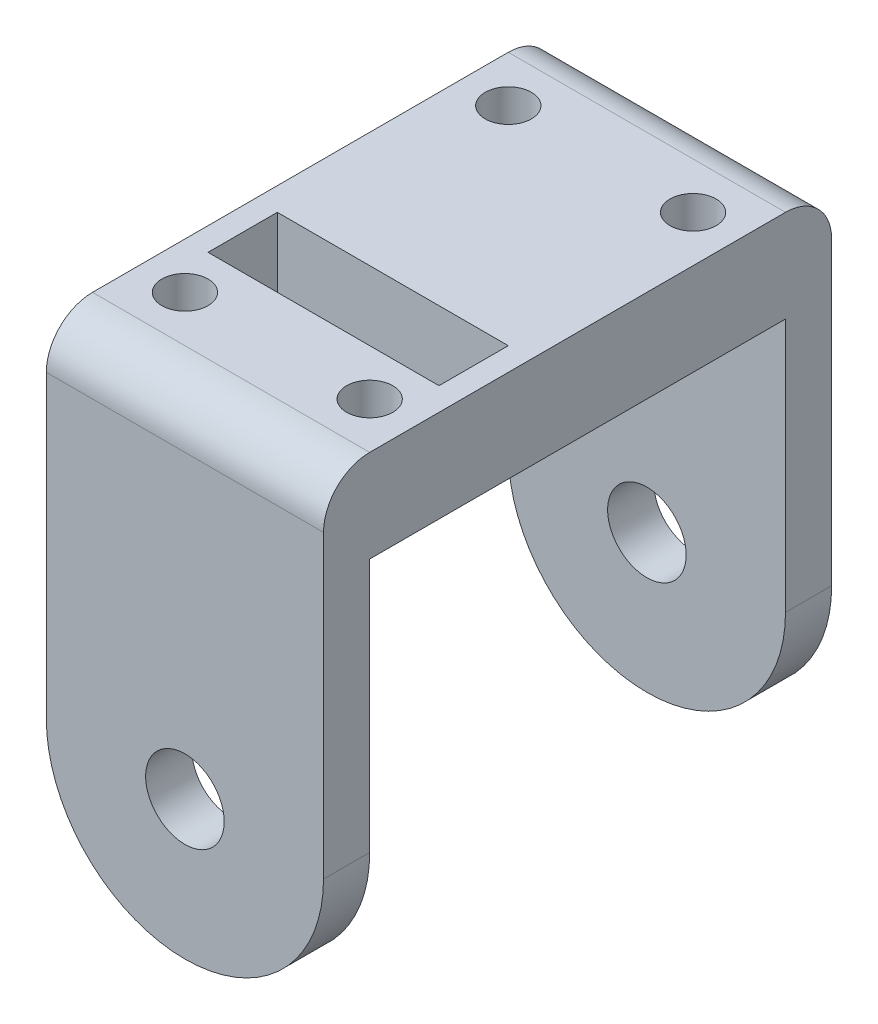
ISO-10303-21;
HEADER;
FILE_DESCRIPTION(('STEP AP214'),'2;1');
FILE_NAME('part.step','',(''),(''),'','','');
FILE_SCHEMA(('AUTOMOTIVE_DESIGN { 1 0 10303 214 1 1 1 1 }'));
ENDSEC;
DATA;
#1=APPLICATION_CONTEXT('core data for automotive mechanical design processes');
#2=APPLICATION_PROTOCOL_DEFINITION('international standard','automotive_design',2000,#1);
#3=PRODUCT_CONTEXT('',#1,'mechanical');
#4=PRODUCT('Part','Part','',(#3));
#5=PRODUCT_RELATED_PRODUCT_CATEGORY('part','',(#4));
#6=PRODUCT_DEFINITION_FORMATION('','',#4);
#7=PRODUCT_DEFINITION_CONTEXT('part definition',#1,'design');
#8=PRODUCT_DEFINITION('design','',#6,#7);
#9=PRODUCT_DEFINITION_SHAPE('','',#8);
#10=(LENGTH_UNIT() NAMED_UNIT(*) SI_UNIT(.MILLI.,.METRE.));
#11=(NAMED_UNIT(*) PLANE_ANGLE_UNIT() SI_UNIT($,.RADIAN.));
#12=(NAMED_UNIT(*) SI_UNIT($,.STERADIAN.) SOLID_ANGLE_UNIT());
#13=UNCERTAINTY_MEASURE_WITH_UNIT(LENGTH_MEASURE(1.E-05),#10,'distance_accuracy_value','');
#14=(GEOMETRIC_REPRESENTATION_CONTEXT(3) GLOBAL_UNCERTAINTY_ASSIGNED_CONTEXT((#13)) GLOBAL_UNIT_ASSIGNED_CONTEXT((#10,
#11,#12)) REPRESENTATION_CONTEXT('',''));
#15=CARTESIAN_POINT('',(0.,0.,0.));
#16=DIRECTION('',(0.,0.,1.));
#17=DIRECTION('',(1.,0.,0.));
#18=AXIS2_PLACEMENT_3D('',#15,#16,#17);
#19=CARTESIAN_POINT('',(0.,0.,0.));
#20=DIRECTION('',(0.,1.,0.));
#21=DIRECTION('',(0.,0.,1.));
#22=AXIS2_PLACEMENT_3D('',#19,#20,#21);
#23=PLANE('',#22);
#24=DIRECTION('',(0.,0.,1.));
#25=VECTOR('',#24,1.);
#26=CARTESIAN_POINT('',(-30.,0.,-45.));
#27=LINE('',#26,#25);
#28=CARTESIAN_POINT('',(-30.,0.,25.));
#29=VERTEX_POINT('',#28);
#30=CARTESIAN_POINT('',(-30.,0.,45.));
#31=VERTEX_POINT('',#30);
#32=EDGE_CURVE('E321',#29,#31,#27,.T.);
#33=ORIENTED_EDGE('',*,*,#32,.F.);
#34=DIRECTION('',(1.,0.,0.));
#35=VECTOR('',#34,1.);
#36=CARTESIAN_POINT('',(0.,0.,25.));
#37=LINE('',#36,#35);
#38=CARTESIAN_POINT('',(30.,0.,25.));
#39=VERTEX_POINT('',#38);
#40=EDGE_CURVE('E361',#29,#39,#37,.T.);
#41=ORIENTED_EDGE('',*,*,#40,.T.);
#42=DIRECTION('',(0.,0.,-1.));
#43=VECTOR('',#42,1.);
#44=CARTESIAN_POINT('',(30.,0.,-45.));
#45=LINE('',#44,#43);
#46=CARTESIAN_POINT('',(30.,0.,45.));
#47=VERTEX_POINT('',#46);
#48=EDGE_CURVE('E312',#47,#39,#45,.T.);
#49=ORIENTED_EDGE('',*,*,#48,.F.);
#50=DIRECTION('',(1.,0.,0.));
#51=VECTOR('',#50,1.);
#52=CARTESIAN_POINT('',(-30.,0.,45.));
#53=LINE('',#52,#51);
#54=EDGE_CURVE('E307',#31,#47,#53,.T.);
#55=ORIENTED_EDGE('',*,*,#54,.F.);
#56=EDGE_LOOP('',(#33,#41,#49,#55));
#57=FACE_BOUND('',#56,.T.);
#58=ADVANCED_FACE('F45',(#57),#23,.F.);
#59=CARTESIAN_POINT('',(0.,20.,0.));
#60=DIRECTION('',(0.,1.,0.));
#61=DIRECTION('',(0.,0.,1.));
#62=AXIS2_PLACEMENT_3D('',#59,#60,#61);
#63=PLANE('',#62);
#64=CARTESIAN_POINT('',(20.,20.,-35.));
#65=DIRECTION('',(0.,1.,0.));
#66=DIRECTION('',(0.,0.,1.));
#67=AXIS2_PLACEMENT_3D('',#64,#65,#66);
#68=CIRCLE('',#67,5.);
#69=CARTESIAN_POINT('',(20.,20.,-30.));
#70=VERTEX_POINT('',#69);
#71=EDGE_CURVE('E269',#70,#70,#68,.T.);
#72=ORIENTED_EDGE('',*,*,#71,.F.);
#73=EDGE_LOOP('',(#72));
#74=FACE_BOUND('',#73,.T.);
#75=CARTESIAN_POINT('',(20.,20.,35.));
#76=DIRECTION('',(0.,1.,0.));
#77=DIRECTION('',(0.,0.,1.));
#78=AXIS2_PLACEMENT_3D('',#75,#76,#77);
#79=CIRCLE('',#78,5.);
#80=CARTESIAN_POINT('',(20.,20.,40.));
#81=VERTEX_POINT('',#80);
#82=EDGE_CURVE('E283',#81,#81,#79,.T.);
#83=ORIENTED_EDGE('',*,*,#82,.F.);
#84=EDGE_LOOP('',(#83));
#85=FACE_BOUND('',#84,.T.);
#86=CARTESIAN_POINT('',(-20.,20.,35.));
#87=DIRECTION('',(0.,1.,0.));
#88=DIRECTION('',(0.,0.,1.));
#89=AXIS2_PLACEMENT_3D('',#86,#87,#88);
#90=CIRCLE('',#89,5.);
#91=CARTESIAN_POINT('',(-20.,20.,40.));
#92=VERTEX_POINT('',#91);
#93=EDGE_CURVE('E275',#92,#92,#90,.T.);
#94=ORIENTED_EDGE('',*,*,#93,.F.);
#95=EDGE_LOOP('',(#94));
#96=FACE_BOUND('',#95,.T.);
#97=CARTESIAN_POINT('',(-20.,20.,-35.));
#98=DIRECTION('',(0.,1.,0.));
#99=DIRECTION('',(0.,0.,1.));
#100=AXIS2_PLACEMENT_3D('',#97,#98,#99);
#101=CIRCLE('',#100,5.);
#102=CARTESIAN_POINT('',(-20.,20.,-30.));
#103=VERTEX_POINT('',#102);
#104=EDGE_CURVE('E274',#103,#103,#101,.T.);
#105=ORIENTED_EDGE('',*,*,#104,.F.);
#106=EDGE_LOOP('',(#105));
#107=FACE_BOUND('',#106,.T.);
#108=DIRECTION('',(0.,0.,-1.));
#109=VECTOR('',#108,1.);
#110=CARTESIAN_POINT('',(30.,20.,-45.));
#111=LINE('',#110,#109);
#112=CARTESIAN_POINT('',(30.,20.,45.));
#113=VERTEX_POINT('',#112);
#114=CARTESIAN_POINT('',(30.,20.,-45.));
#115=VERTEX_POINT('',#114);
#116=EDGE_CURVE('E302',#113,#115,#111,.T.);
#117=ORIENTED_EDGE('',*,*,#116,.T.);
#118=DIRECTION('',(-1.,0.,0.));
#119=VECTOR('',#118,1.);
#120=CARTESIAN_POINT('',(-30.,20.,-45.));
#121=LINE('',#120,#119);
#122=CARTESIAN_POINT('',(-30.,20.,-45.));
#123=VERTEX_POINT('',#122);
#124=EDGE_CURVE('E335',#115,#123,#121,.T.);
#125=ORIENTED_EDGE('',*,*,#124,.T.);
#126=DIRECTION('',(0.,0.,1.));
#127=VECTOR('',#126,1.);
#128=CARTESIAN_POINT('',(-30.,20.,-45.));
#129=LINE('',#128,#127);
#130=CARTESIAN_POINT('',(-30.,20.,45.));
#131=VERTEX_POINT('',#130);
#132=EDGE_CURVE('E306',#123,#131,#129,.T.);
#133=ORIENTED_EDGE('',*,*,#132,.T.);
#134=DIRECTION('',(-1.,0.,0.));
#135=VECTOR('',#134,1.);
#136=CARTESIAN_POINT('',(30.,20.,45.));
#137=LINE('',#136,#135);
#138=EDGE_CURVE('E311',#131,#113,#137,.F.);
#139=ORIENTED_EDGE('',*,*,#138,.T.);
#140=EDGE_LOOP('',(#117,#125,#133,#139));
#141=FACE_BOUND('',#140,.T.);
#142=DIRECTION('',(1.,0.,0.));
#143=VECTOR('',#142,1.);
#144=CARTESIAN_POINT('',(0.,20.,9.99999999999999));
#145=LINE('',#144,#143);
#146=CARTESIAN_POINT('',(-25.,20.,9.99999999999999));
#147=VERTEX_POINT('',#146);
#148=CARTESIAN_POINT('',(25.,20.,9.99999999999999));
#149=VERTEX_POINT('',#148);
#150=EDGE_CURVE('E174',#147,#149,#145,.T.);
#151=ORIENTED_EDGE('',*,*,#150,.T.);
#152=DIRECTION('',(0.,0.,1.));
#153=VECTOR('',#152,1.);
#154=CARTESIAN_POINT('',(25.,20.,0.));
#155=LINE('',#154,#153);
#156=CARTESIAN_POINT('',(25.,20.,25.));
#157=VERTEX_POINT('',#156);
#158=EDGE_CURVE('E180',#149,#157,#155,.T.);
#159=ORIENTED_EDGE('',*,*,#158,.T.);
#160=DIRECTION('',(1.,0.,0.));
#161=VECTOR('',#160,1.);
#162=CARTESIAN_POINT('',(0.,20.,25.));
#163=LINE('',#162,#161);
#164=CARTESIAN_POINT('',(-25.,20.,25.));
#165=VERTEX_POINT('',#164);
#166=EDGE_CURVE('E184',#165,#157,#163,.T.);
#167=ORIENTED_EDGE('',*,*,#166,.F.);
#168=DIRECTION('',(0.,0.,1.));
#169=VECTOR('',#168,1.);
#170=CARTESIAN_POINT('',(-25.,20.,0.));
#171=LINE('',#170,#169);
#172=EDGE_CURVE('E163',#147,#165,#171,.T.);
#173=ORIENTED_EDGE('',*,*,#172,.F.);
#174=EDGE_LOOP('',(#151,#159,#167,#173));
#175=FACE_BOUND('',#174,.T.);
#176=ADVANCED_FACE('F182',(#74,#85,#96,#107,#141,#175),#63,.T.);
#177=DIRECTION('',(1.,0.,0.));
#178=VECTOR('',#177,1.);
#179=CARTESIAN_POINT('',(0.,0.,9.99999999999999));
#180=LINE('',#179,#178);
#181=CARTESIAN_POINT('',(-30.,0.,9.99999999999997));
#182=VERTEX_POINT('',#181);
#183=CARTESIAN_POINT('',(30.,0.,9.99999999999997));
#184=VERTEX_POINT('',#183);
#185=EDGE_CURVE('E358',#182,#184,#180,.T.);
#186=ORIENTED_EDGE('',*,*,#185,.F.);
#187=CARTESIAN_POINT('',(-30.,0.,-45.));
#188=VERTEX_POINT('',#187);
#189=EDGE_CURVE('E322',#188,#182,#27,.T.);
#190=ORIENTED_EDGE('',*,*,#189,.F.);
#191=DIRECTION('',(-1.,0.,0.));
#192=VECTOR('',#191,1.);
#193=CARTESIAN_POINT('',(-30.,0.,-45.));
#194=LINE('',#193,#192);
#195=CARTESIAN_POINT('',(30.,0.,-45.));
#196=VERTEX_POINT('',#195);
#197=EDGE_CURVE('E316',#196,#188,#194,.T.);
#198=ORIENTED_EDGE('',*,*,#197,.F.);
#199=EDGE_CURVE('E298',#184,#196,#45,.T.);
#200=ORIENTED_EDGE('',*,*,#199,.F.);
#201=EDGE_LOOP('',(#186,#190,#198,#200));
#202=FACE_BOUND('',#201,.T.);
#203=ADVANCED_FACE('F391',(#202),#23,.F.);
#204=CARTESIAN_POINT('',(30.,20.,-45.));
#205=DIRECTION('',(-1.,0.,0.));
#206=DIRECTION('',(0.,0.,1.));
#207=AXIS2_PLACEMENT_3D('',#204,#205,#206);
#208=PLANE('',#207);
#209=DIRECTION('',(0.,1.,0.));
#210=VECTOR('',#209,1.);
#211=CARTESIAN_POINT('',(30.,0.,-55.));
#212=LINE('',#211,#210);
#213=CARTESIAN_POINT('',(30.,-55.,-55.));
#214=VERTEX_POINT('',#213);
#215=CARTESIAN_POINT('',(30.,10.,-55.));
#216=VERTEX_POINT('',#215);
#217=EDGE_CURVE('E215',#214,#216,#212,.T.);
#218=ORIENTED_EDGE('',*,*,#217,.T.);
#219=CARTESIAN_POINT('',(30.,10.,-45.));
#220=DIRECTION('',(-1.,0.,0.));
#221=DIRECTION('',(0.,0.,1.));
#222=AXIS2_PLACEMENT_3D('',#219,#220,#221);
#223=CIRCLE('',#222,10.);
#224=EDGE_CURVE('E351',#216,#115,#223,.F.);
#225=ORIENTED_EDGE('',*,*,#224,.T.);
#226=ORIENTED_EDGE('',*,*,#116,.F.);
#227=CARTESIAN_POINT('',(30.,9.99999999999999,45.));
#228=DIRECTION('',(-1.,0.,0.));
#229=DIRECTION('',(0.,0.,1.));
#230=AXIS2_PLACEMENT_3D('',#227,#228,#229);
#231=CIRCLE('',#230,10.);
#232=CARTESIAN_POINT('',(30.,9.99999999999999,55.));
#233=VERTEX_POINT('',#232);
#234=EDGE_CURVE('E348',#113,#233,#231,.F.);
#235=ORIENTED_EDGE('',*,*,#234,.T.);
#236=DIRECTION('',(0.,1.,0.));
#237=VECTOR('',#236,1.);
#238=CARTESIAN_POINT('',(30.,-55.,55.));
#239=LINE('',#238,#237);
#240=CARTESIAN_POINT('',(30.,-55.,55.));
#241=VERTEX_POINT('',#240);
#242=EDGE_CURVE('E248',#241,#233,#239,.T.);
#243=ORIENTED_EDGE('',*,*,#242,.F.);
#244=DIRECTION('',(0.,0.,-1.));
#245=VECTOR('',#244,1.);
#246=CARTESIAN_POINT('',(30.,-55.,55.));
#247=LINE('',#246,#245);
#248=CARTESIAN_POINT('',(30.,-55.,45.));
#249=VERTEX_POINT('',#248);
#250=EDGE_CURVE('E252',#241,#249,#247,.T.);
#251=ORIENTED_EDGE('',*,*,#250,.T.);
#252=DIRECTION('',(0.,1.,0.));
#253=VECTOR('',#252,1.);
#254=CARTESIAN_POINT('',(30.,0.,45.));
#255=LINE('',#254,#253);
#256=EDGE_CURVE('E245',#249,#47,#255,.T.);
#257=ORIENTED_EDGE('',*,*,#256,.T.);
#258=ORIENTED_EDGE('',*,*,#48,.T.);
#259=EDGE_CURVE('E317',#39,#184,#45,.T.);
#260=ORIENTED_EDGE('',*,*,#259,.T.);
#261=ORIENTED_EDGE('',*,*,#199,.T.);
#262=DIRECTION('',(0.,1.,0.));
#263=VECTOR('',#262,1.);
#264=CARTESIAN_POINT('',(30.,-55.,-45.));
#265=LINE('',#264,#263);
#266=CARTESIAN_POINT('',(30.,-55.,-45.));
#267=VERTEX_POINT('',#266);
#268=EDGE_CURVE('E211',#267,#196,#265,.T.);
#269=ORIENTED_EDGE('',*,*,#268,.F.);
#270=DIRECTION('',(0.,0.,1.));
#271=VECTOR('',#270,1.);
#272=CARTESIAN_POINT('',(30.,-55.,-55.));
#273=LINE('',#272,#271);
#274=EDGE_CURVE('E237',#214,#267,#273,.T.);
#275=ORIENTED_EDGE('',*,*,#274,.F.);
#276=EDGE_LOOP('',(#218,#225,#226,#235,#243,#251,#257,#258,#260,#261,#269,#275));
#277=FACE_BOUND('',#276,.T.);
#278=ADVANCED_FACE('F381',(#277),#208,.F.);
#279=CARTESIAN_POINT('',(-30.,20.,-45.));
#280=DIRECTION('',(1.,0.,0.));
#281=DIRECTION('',(0.,0.,-1.));
#282=AXIS2_PLACEMENT_3D('',#279,#280,#281);
#283=PLANE('',#282);
#284=ORIENTED_EDGE('',*,*,#132,.F.);
#285=CARTESIAN_POINT('',(-30.,10.,-45.));
#286=DIRECTION('',(1.,0.,0.));
#287=DIRECTION('',(0.,0.,-1.));
#288=AXIS2_PLACEMENT_3D('',#285,#286,#287);
#289=CIRCLE('',#288,10.);
#290=CARTESIAN_POINT('',(-30.,10.,-55.));
#291=VERTEX_POINT('',#290);
#292=EDGE_CURVE('E342',#123,#291,#289,.F.);
#293=ORIENTED_EDGE('',*,*,#292,.T.);
#294=DIRECTION('',(0.,-1.,0.));
#295=VECTOR('',#294,1.);
#296=CARTESIAN_POINT('',(-30.,20.,-55.));
#297=LINE('',#296,#295);
#298=CARTESIAN_POINT('',(-30.,-55.,-55.));
#299=VERTEX_POINT('',#298);
#300=EDGE_CURVE('E212',#291,#299,#297,.T.);
#301=ORIENTED_EDGE('',*,*,#300,.T.);
#302=DIRECTION('',(0.,0.,1.));
#303=VECTOR('',#302,1.);
#304=CARTESIAN_POINT('',(-30.,-55.,-55.));
#305=LINE('',#304,#303);
#306=CARTESIAN_POINT('',(-30.,-55.,-45.));
#307=VERTEX_POINT('',#306);
#308=EDGE_CURVE('E224',#299,#307,#305,.T.);
#309=ORIENTED_EDGE('',*,*,#308,.T.);
#310=DIRECTION('',(0.,-1.,0.));
#311=VECTOR('',#310,1.);
#312=CARTESIAN_POINT('',(-30.,0.,-45.));
#313=LINE('',#312,#311);
#314=EDGE_CURVE('E216',#188,#307,#313,.T.);
#315=ORIENTED_EDGE('',*,*,#314,.F.);
#316=ORIENTED_EDGE('',*,*,#189,.T.);
#317=EDGE_CURVE('E326',#182,#29,#27,.T.);
#318=ORIENTED_EDGE('',*,*,#317,.T.);
#319=ORIENTED_EDGE('',*,*,#32,.T.);
#320=DIRECTION('',(0.,-1.,0.));
#321=VECTOR('',#320,1.);
#322=CARTESIAN_POINT('',(-30.,0.,45.));
#323=LINE('',#322,#321);
#324=CARTESIAN_POINT('',(-30.,-55.,45.));
#325=VERTEX_POINT('',#324);
#326=EDGE_CURVE('E240',#31,#325,#323,.T.);
#327=ORIENTED_EDGE('',*,*,#326,.T.);
#328=DIRECTION('',(0.,0.,-1.));
#329=VECTOR('',#328,1.);
#330=CARTESIAN_POINT('',(-30.,-55.,55.));
#331=LINE('',#330,#329);
#332=CARTESIAN_POINT('',(-30.,-55.,55.));
#333=VERTEX_POINT('',#332);
#334=EDGE_CURVE('E265',#333,#325,#331,.T.);
#335=ORIENTED_EDGE('',*,*,#334,.F.);
#336=DIRECTION('',(0.,-1.,0.));
#337=VECTOR('',#336,1.);
#338=CARTESIAN_POINT('',(-30.,20.,55.));
#339=LINE('',#338,#337);
#340=CARTESIAN_POINT('',(-30.,9.99999999999999,55.));
#341=VERTEX_POINT('',#340);
#342=EDGE_CURVE('E241',#341,#333,#339,.T.);
#343=ORIENTED_EDGE('',*,*,#342,.F.);
#344=CARTESIAN_POINT('',(-30.,9.99999999999999,45.));
#345=DIRECTION('',(1.,0.,0.));
#346=DIRECTION('',(0.,0.,-1.));
#347=AXIS2_PLACEMENT_3D('',#344,#345,#346);
#348=CIRCLE('',#347,10.);
#349=EDGE_CURVE('E339',#341,#131,#348,.F.);
#350=ORIENTED_EDGE('',*,*,#349,.T.);
#351=EDGE_LOOP('',(#284,#293,#301,#309,#315,#316,#318,#319,#327,#335,#343,#350));
#352=FACE_BOUND('',#351,.T.);
#353=ADVANCED_FACE('F411',(#352),#283,.F.);
#354=CARTESIAN_POINT('',(-20.,10.,-35.));
#355=DIRECTION('',(0.,1.,0.));
#356=DIRECTION('',(0.,0.,1.));
#357=AXIS2_PLACEMENT_3D('',#354,#355,#356);
#358=CYLINDRICAL_SURFACE('',#357,5.);
#359=CARTESIAN_POINT('',(-20.,10.,-35.));
#360=DIRECTION('',(0.,1.,0.));
#361=DIRECTION('',(0.,0.,1.));
#362=AXIS2_PLACEMENT_3D('',#359,#360,#361);
#363=CIRCLE('',#362,5.);
#364=CARTESIAN_POINT('',(-20.,10.,-30.));
#365=VERTEX_POINT('',#364);
#366=EDGE_CURVE('E294',#365,#365,#363,.T.);
#367=ORIENTED_EDGE('',*,*,#366,.F.);
#368=EDGE_LOOP('',(#367));
#369=FACE_BOUND('',#368,.T.);
#370=ORIENTED_EDGE('',*,*,#104,.T.);
#371=EDGE_LOOP('',(#370));
#372=FACE_BOUND('',#371,.T.);
#373=ADVANCED_FACE('F466',(#369,#372),#358,.F.);
#374=CARTESIAN_POINT('',(0.,10.,0.));
#375=DIRECTION('',(0.,1.,0.));
#376=DIRECTION('',(0.,0.,1.));
#377=AXIS2_PLACEMENT_3D('',#374,#375,#376);
#378=PLANE('',#377);
#379=ORIENTED_EDGE('',*,*,#366,.T.);
#380=EDGE_LOOP('',(#379));
#381=FACE_BOUND('',#380,.T.);
#382=ADVANCED_FACE('F637',(#381),#378,.T.);
#383=CARTESIAN_POINT('',(-20.,10.,35.));
#384=DIRECTION('',(0.,1.,0.));
#385=DIRECTION('',(0.,0.,1.));
#386=AXIS2_PLACEMENT_3D('',#383,#384,#385);
#387=CYLINDRICAL_SURFACE('',#386,5.);
#388=CARTESIAN_POINT('',(-20.,10.,35.));
#389=DIRECTION('',(0.,1.,0.));
#390=DIRECTION('',(0.,0.,1.));
#391=AXIS2_PLACEMENT_3D('',#388,#389,#390);
#392=CIRCLE('',#391,5.);
#393=CARTESIAN_POINT('',(-20.,10.,40.));
#394=VERTEX_POINT('',#393);
#395=EDGE_CURVE('E270',#394,#394,#392,.T.);
#396=ORIENTED_EDGE('',*,*,#395,.F.);
#397=EDGE_LOOP('',(#396));
#398=FACE_BOUND('',#397,.T.);
#399=ORIENTED_EDGE('',*,*,#93,.T.);
#400=EDGE_LOOP('',(#399));
#401=FACE_BOUND('',#400,.T.);
#402=ADVANCED_FACE('F628',(#398,#401),#387,.F.);
#403=CARTESIAN_POINT('',(0.,10.,0.));
#404=DIRECTION('',(0.,1.,0.));
#405=DIRECTION('',(0.,0.,1.));
#406=AXIS2_PLACEMENT_3D('',#403,#404,#405);
#407=PLANE('',#406);
#408=ORIENTED_EDGE('',*,*,#395,.T.);
#409=EDGE_LOOP('',(#408));
#410=FACE_BOUND('',#409,.T.);
#411=ADVANCED_FACE('F618',(#410),#407,.T.);
#412=CARTESIAN_POINT('',(20.,10.,35.));
#413=DIRECTION('',(0.,1.,0.));
#414=DIRECTION('',(0.,0.,1.));
#415=AXIS2_PLACEMENT_3D('',#412,#413,#414);
#416=CYLINDRICAL_SURFACE('',#415,5.);
#417=CARTESIAN_POINT('',(20.,10.,35.));
#418=DIRECTION('',(0.,1.,0.));
#419=DIRECTION('',(0.,0.,1.));
#420=AXIS2_PLACEMENT_3D('',#417,#418,#419);
#421=CIRCLE('',#420,5.);
#422=CARTESIAN_POINT('',(20.,10.,40.));
#423=VERTEX_POINT('',#422);
#424=EDGE_CURVE('E279',#423,#423,#421,.T.);
#425=ORIENTED_EDGE('',*,*,#424,.F.);
#426=EDGE_LOOP('',(#425));
#427=FACE_BOUND('',#426,.T.);
#428=ORIENTED_EDGE('',*,*,#82,.T.);
#429=EDGE_LOOP('',(#428));
#430=FACE_BOUND('',#429,.T.);
#431=ADVANCED_FACE('F609',(#427,#430),#416,.F.);
#432=CARTESIAN_POINT('',(0.,10.,0.));
#433=DIRECTION('',(0.,1.,0.));
#434=DIRECTION('',(0.,0.,1.));
#435=AXIS2_PLACEMENT_3D('',#432,#433,#434);
#436=PLANE('',#435);
#437=ORIENTED_EDGE('',*,*,#424,.T.);
#438=EDGE_LOOP('',(#437));
#439=FACE_BOUND('',#438,.T.);
#440=ADVANCED_FACE('F599',(#439),#436,.T.);
#441=CARTESIAN_POINT('',(20.,10.,-35.));
#442=DIRECTION('',(0.,1.,0.));
#443=DIRECTION('',(0.,0.,1.));
#444=AXIS2_PLACEMENT_3D('',#441,#442,#443);
#445=CYLINDRICAL_SURFACE('',#444,5.);
#446=CARTESIAN_POINT('',(20.,10.,-35.));
#447=DIRECTION('',(0.,1.,0.));
#448=DIRECTION('',(0.,0.,1.));
#449=AXIS2_PLACEMENT_3D('',#446,#447,#448);
#450=CIRCLE('',#449,5.);
#451=CARTESIAN_POINT('',(20.,10.,-30.));
#452=VERTEX_POINT('',#451);
#453=EDGE_CURVE('E287',#452,#452,#450,.T.);
#454=ORIENTED_EDGE('',*,*,#453,.F.);
#455=EDGE_LOOP('',(#454));
#456=FACE_BOUND('',#455,.T.);
#457=ORIENTED_EDGE('',*,*,#71,.T.);
#458=EDGE_LOOP('',(#457));
#459=FACE_BOUND('',#458,.T.);
#460=ADVANCED_FACE('F589',(#456,#459),#445,.F.);
#461=CARTESIAN_POINT('',(0.,10.,0.));
#462=DIRECTION('',(0.,1.,0.));
#463=DIRECTION('',(0.,0.,1.));
#464=AXIS2_PLACEMENT_3D('',#461,#462,#463);
#465=PLANE('',#464);
#466=ORIENTED_EDGE('',*,*,#453,.T.);
#467=EDGE_LOOP('',(#466));
#468=FACE_BOUND('',#467,.T.);
#469=ADVANCED_FACE('F580',(#468),#465,.T.);
#470=CARTESIAN_POINT('',(0.,-55.,55.));
#471=DIRECTION('',(0.,0.,-1.));
#472=DIRECTION('',(-1.,0.,0.));
#473=AXIS2_PLACEMENT_3D('',#470,#471,#472);
#474=CYLINDRICAL_SURFACE('',#473,30.);
#475=CARTESIAN_POINT('',(0.,-55.,45.));
#476=DIRECTION('',(0.,0.,1.));
#477=DIRECTION('',(-1.,0.,0.));
#478=AXIS2_PLACEMENT_3D('',#475,#476,#477);
#479=CIRCLE('',#478,30.);
#480=EDGE_CURVE('E255',#325,#249,#479,.T.);
#481=ORIENTED_EDGE('',*,*,#480,.T.);
#482=ORIENTED_EDGE('',*,*,#250,.F.);
#483=CARTESIAN_POINT('',(0.,-55.,55.));
#484=DIRECTION('',(0.,0.,1.));
#485=DIRECTION('',(-1.,0.,0.));
#486=AXIS2_PLACEMENT_3D('',#483,#484,#485);
#487=CIRCLE('',#486,30.);
#488=EDGE_CURVE('E244',#333,#241,#487,.T.);
#489=ORIENTED_EDGE('',*,*,#488,.F.);
#490=ORIENTED_EDGE('',*,*,#334,.T.);
#491=EDGE_LOOP('',(#481,#482,#489,#490));
#492=FACE_BOUND('',#491,.T.);
#493=ADVANCED_FACE('F425',(#492),#474,.T.);
#494=CARTESIAN_POINT('',(0.,-55.,55.));
#495=DIRECTION('',(0.,0.,-1.));
#496=DIRECTION('',(-1.,0.,0.));
#497=AXIS2_PLACEMENT_3D('',#494,#495,#496);
#498=PLANE('',#497);
#499=CARTESIAN_POINT('',(0.,-55.,55.));
#500=DIRECTION('',(0.,0.,1.));
#501=DIRECTION('',(1.,0.,0.));
#502=AXIS2_PLACEMENT_3D('',#499,#500,#501);
#503=CIRCLE('',#502,8.5);
#504=CARTESIAN_POINT('',(8.5,-55.,55.));
#505=VERTEX_POINT('',#504);
#506=EDGE_CURVE('E194',#505,#505,#503,.T.);
#507=ORIENTED_EDGE('',*,*,#506,.F.);
#508=EDGE_LOOP('',(#507));
#509=FACE_BOUND('',#508,.T.);
#510=ORIENTED_EDGE('',*,*,#242,.T.);
#511=DIRECTION('',(-1.,0.,0.));
#512=VECTOR('',#511,1.);
#513=CARTESIAN_POINT('',(-30.,9.99999999999999,55.));
#514=LINE('',#513,#512);
#515=EDGE_CURVE('E354',#233,#341,#514,.T.);
#516=ORIENTED_EDGE('',*,*,#515,.T.);
#517=ORIENTED_EDGE('',*,*,#342,.T.);
#518=ORIENTED_EDGE('',*,*,#488,.T.);
#519=EDGE_LOOP('',(#510,#516,#517,#518));
#520=FACE_BOUND('',#519,.T.);
#521=ADVANCED_FACE('F420',(#509,#520),#498,.F.);
#522=CARTESIAN_POINT('',(0.,-55.,45.));
#523=DIRECTION('',(0.,0.,-1.));
#524=DIRECTION('',(-1.,0.,0.));
#525=AXIS2_PLACEMENT_3D('',#522,#523,#524);
#526=PLANE('',#525);
#527=CARTESIAN_POINT('',(0.,-55.,45.));
#528=DIRECTION('',(0.,0.,-1.));
#529=DIRECTION('',(-1.,0.,0.));
#530=AXIS2_PLACEMENT_3D('',#527,#528,#529);
#531=CIRCLE('',#530,8.5);
#532=CARTESIAN_POINT('',(-8.5,-55.,45.));
#533=VERTEX_POINT('',#532);
#534=EDGE_CURVE('E207',#533,#533,#531,.T.);
#535=ORIENTED_EDGE('',*,*,#534,.F.);
#536=EDGE_LOOP('',(#535));
#537=FACE_BOUND('',#536,.T.);
#538=ORIENTED_EDGE('',*,*,#326,.F.);
#539=ORIENTED_EDGE('',*,*,#54,.T.);
#540=ORIENTED_EDGE('',*,*,#256,.F.);
#541=ORIENTED_EDGE('',*,*,#480,.F.);
#542=EDGE_LOOP('',(#538,#539,#540,#541));
#543=FACE_BOUND('',#542,.T.);
#544=ADVANCED_FACE('F429',(#537,#543),#526,.T.);
#545=CARTESIAN_POINT('',(0.,-55.,-55.));
#546=DIRECTION('',(0.,0.,1.));
#547=DIRECTION('',(1.,0.,0.));
#548=AXIS2_PLACEMENT_3D('',#545,#546,#547);
#549=CYLINDRICAL_SURFACE('',#548,30.);
#550=CARTESIAN_POINT('',(0.,-55.,-45.));
#551=DIRECTION('',(0.,0.,1.));
#552=DIRECTION('',(-1.,0.,0.));
#553=AXIS2_PLACEMENT_3D('',#550,#551,#552);
#554=CIRCLE('',#553,30.);
#555=EDGE_CURVE('E228',#307,#267,#554,.T.);
#556=ORIENTED_EDGE('',*,*,#555,.F.);
#557=ORIENTED_EDGE('',*,*,#308,.F.);
#558=CARTESIAN_POINT('',(0.,-55.,-55.));
#559=DIRECTION('',(0.,0.,1.));
#560=DIRECTION('',(-1.,0.,0.));
#561=AXIS2_PLACEMENT_3D('',#558,#559,#560);
#562=CIRCLE('',#561,30.);
#563=EDGE_CURVE('E220',#299,#214,#562,.T.);
#564=ORIENTED_EDGE('',*,*,#563,.T.);
#565=ORIENTED_EDGE('',*,*,#274,.T.);
#566=EDGE_LOOP('',(#556,#557,#564,#565));
#567=FACE_BOUND('',#566,.T.);
#568=ADVANCED_FACE('F398',(#567),#549,.T.);
#569=CARTESIAN_POINT('',(0.,-55.,-55.));
#570=DIRECTION('',(0.,0.,1.));
#571=DIRECTION('',(-1.,0.,0.));
#572=AXIS2_PLACEMENT_3D('',#569,#570,#571);
#573=PLANE('',#572);
#574=CARTESIAN_POINT('',(0.,-55.,-55.));
#575=DIRECTION('',(0.,0.,1.));
#576=DIRECTION('',(1.,0.,0.));
#577=AXIS2_PLACEMENT_3D('',#574,#575,#576);
#578=CIRCLE('',#577,8.5);
#579=CARTESIAN_POINT('',(8.5,-55.,-55.));
#580=VERTEX_POINT('',#579);
#581=EDGE_CURVE('E199',#580,#580,#578,.T.);
#582=ORIENTED_EDGE('',*,*,#581,.T.);
#583=EDGE_LOOP('',(#582));
#584=FACE_BOUND('',#583,.T.);
#585=ORIENTED_EDGE('',*,*,#300,.F.);
#586=DIRECTION('',(-1.,0.,0.));
#587=VECTOR('',#586,1.);
#588=CARTESIAN_POINT('',(30.,10.,-55.));
#589=LINE('',#588,#587);
#590=EDGE_CURVE('E345',#291,#216,#589,.F.);
#591=ORIENTED_EDGE('',*,*,#590,.T.);
#592=ORIENTED_EDGE('',*,*,#217,.F.);
#593=ORIENTED_EDGE('',*,*,#563,.F.);
#594=EDGE_LOOP('',(#585,#591,#592,#593));
#595=FACE_BOUND('',#594,.T.);
#596=ADVANCED_FACE('F538',(#584,#595),#573,.F.);
#597=CARTESIAN_POINT('',(0.,-55.,-45.));
#598=DIRECTION('',(0.,0.,1.));
#599=DIRECTION('',(-1.,0.,0.));
#600=AXIS2_PLACEMENT_3D('',#597,#598,#599);
#601=PLANE('',#600);
#602=CARTESIAN_POINT('',(0.,-55.,-45.));
#603=DIRECTION('',(0.,0.,1.));
#604=DIRECTION('',(1.,0.,0.));
#605=AXIS2_PLACEMENT_3D('',#602,#603,#604);
#606=CIRCLE('',#605,8.5);
#607=CARTESIAN_POINT('',(8.5,-55.,-45.));
#608=VERTEX_POINT('',#607);
#609=EDGE_CURVE('E203',#608,#608,#606,.T.);
#610=ORIENTED_EDGE('',*,*,#609,.F.);
#611=EDGE_LOOP('',(#610));
#612=FACE_BOUND('',#611,.T.);
#613=ORIENTED_EDGE('',*,*,#268,.T.);
#614=ORIENTED_EDGE('',*,*,#197,.T.);
#615=ORIENTED_EDGE('',*,*,#314,.T.);
#616=ORIENTED_EDGE('',*,*,#555,.T.);
#617=EDGE_LOOP('',(#613,#614,#615,#616));
#618=FACE_BOUND('',#617,.T.);
#619=ADVANCED_FACE('F394',(#612,#618),#601,.T.);
#620=CARTESIAN_POINT('',(0.,-55.,-55.));
#621=DIRECTION('',(0.,0.,1.));
#622=DIRECTION('',(1.,0.,0.));
#623=AXIS2_PLACEMENT_3D('',#620,#621,#622);
#624=CYLINDRICAL_SURFACE('',#623,8.5);
#625=ORIENTED_EDGE('',*,*,#609,.T.);
#626=EDGE_LOOP('',(#625));
#627=FACE_BOUND('',#626,.T.);
#628=ORIENTED_EDGE('',*,*,#581,.F.);
#629=EDGE_LOOP('',(#628));
#630=FACE_BOUND('',#629,.T.);
#631=ADVANCED_FACE('F523',(#627,#630),#624,.F.);
#632=ORIENTED_EDGE('',*,*,#534,.T.);
#633=EDGE_LOOP('',(#632));
#634=FACE_BOUND('',#633,.T.);
#635=ORIENTED_EDGE('',*,*,#506,.T.);
#636=EDGE_LOOP('',(#635));
#637=FACE_BOUND('',#636,.T.);
#638=ADVANCED_FACE('F469',(#634,#637),#624,.F.);
#639=CARTESIAN_POINT('',(0.,10.,-45.));
#640=DIRECTION('',(1.,0.,0.));
#641=DIRECTION('',(0.,0.,-1.));
#642=AXIS2_PLACEMENT_3D('',#639,#640,#641);
#643=CYLINDRICAL_SURFACE('',#642,10.);
#644=ORIENTED_EDGE('',*,*,#224,.F.);
#645=ORIENTED_EDGE('',*,*,#590,.F.);
#646=ORIENTED_EDGE('',*,*,#292,.F.);
#647=ORIENTED_EDGE('',*,*,#124,.F.);
#648=EDGE_LOOP('',(#644,#645,#646,#647));
#649=FACE_BOUND('',#648,.T.);
#650=ADVANCED_FACE('F406',(#649),#643,.T.);
#651=CARTESIAN_POINT('',(0.,9.99999999999999,45.));
#652=DIRECTION('',(1.,0.,0.));
#653=DIRECTION('',(0.,0.,-1.));
#654=AXIS2_PLACEMENT_3D('',#651,#652,#653);
#655=CYLINDRICAL_SURFACE('',#654,10.);
#656=ORIENTED_EDGE('',*,*,#234,.F.);
#657=ORIENTED_EDGE('',*,*,#138,.F.);
#658=ORIENTED_EDGE('',*,*,#349,.F.);
#659=ORIENTED_EDGE('',*,*,#515,.F.);
#660=EDGE_LOOP('',(#656,#657,#658,#659));
#661=FACE_BOUND('',#660,.T.);
#662=ADVANCED_FACE('F418',(#661),#655,.T.);
#663=CARTESIAN_POINT('',(25.,-85.,0.));
#664=DIRECTION('',(-1.,0.,0.));
#665=DIRECTION('',(0.,0.,1.));
#666=AXIS2_PLACEMENT_3D('',#663,#664,#665);
#667=PLANE('',#666);
#668=DIRECTION('',(0.,1.,0.));
#669=VECTOR('',#668,1.);
#670=CARTESIAN_POINT('',(25.,-85.,9.99999999999999));
#671=LINE('',#670,#669);
#672=CARTESIAN_POINT('',(25.,5.,9.99999999999999));
#673=VERTEX_POINT('',#672);
#674=EDGE_CURVE('E171',#673,#149,#671,.T.);
#675=ORIENTED_EDGE('',*,*,#674,.F.);
#676=DIRECTION('',(0.,0.,1.));
#677=VECTOR('',#676,1.);
#678=CARTESIAN_POINT('',(25.,5.,25.));
#679=LINE('',#678,#677);
#680=CARTESIAN_POINT('',(25.,5.,25.));
#681=VERTEX_POINT('',#680);
#682=EDGE_CURVE('E366',#673,#681,#679,.T.);
#683=ORIENTED_EDGE('',*,*,#682,.T.);
#684=DIRECTION('',(0.,1.,0.));
#685=VECTOR('',#684,1.);
#686=CARTESIAN_POINT('',(25.,-85.,25.));
#687=LINE('',#686,#685);
#688=EDGE_CURVE('E191',#681,#157,#687,.T.);
#689=ORIENTED_EDGE('',*,*,#688,.T.);
#690=ORIENTED_EDGE('',*,*,#158,.F.);
#691=EDGE_LOOP('',(#675,#683,#689,#690));
#692=FACE_BOUND('',#691,.T.);
#693=ADVANCED_FACE('F439',(#692),#667,.T.);
#694=CARTESIAN_POINT('',(0.,-85.,25.));
#695=DIRECTION('',(0.,0.,1.));
#696=DIRECTION('',(1.,0.,0.));
#697=AXIS2_PLACEMENT_3D('',#694,#695,#696);
#698=PLANE('',#697);
#699=ORIENTED_EDGE('',*,*,#40,.F.);
#700=CARTESIAN_POINT('',(-30.,5.,25.));
#701=DIRECTION('',(0.,0.,1.));
#702=DIRECTION('',(1.,0.,0.));
#703=AXIS2_PLACEMENT_3D('',#700,#701,#702);
#704=CIRCLE('',#703,5.);
#705=CARTESIAN_POINT('',(-25.,5.,25.));
#706=VERTEX_POINT('',#705);
#707=EDGE_CURVE('E369',#29,#706,#704,.T.);
#708=ORIENTED_EDGE('',*,*,#707,.T.);
#709=DIRECTION('',(0.,1.,0.));
#710=VECTOR('',#709,1.);
#711=CARTESIAN_POINT('',(-25.,-85.,25.));
#712=LINE('',#711,#710);
#713=EDGE_CURVE('E170',#706,#165,#712,.T.);
#714=ORIENTED_EDGE('',*,*,#713,.T.);
#715=ORIENTED_EDGE('',*,*,#166,.T.);
#716=ORIENTED_EDGE('',*,*,#688,.F.);
#717=CARTESIAN_POINT('',(30.,5.,25.));
#718=DIRECTION('',(0.,0.,1.));
#719=DIRECTION('',(1.,0.,0.));
#720=AXIS2_PLACEMENT_3D('',#717,#718,#719);
#721=CIRCLE('',#720,5.);
#722=EDGE_CURVE('E54',#681,#39,#721,.T.);
#723=ORIENTED_EDGE('',*,*,#722,.T.);
#724=EDGE_LOOP('',(#699,#708,#714,#715,#716,#723));
#725=FACE_BOUND('',#724,.T.);
#726=ADVANCED_FACE('F377',(#725),#698,.F.);
#727=CARTESIAN_POINT('',(-25.,-85.,0.));
#728=DIRECTION('',(-1.,0.,0.));
#729=DIRECTION('',(0.,0.,1.));
#730=AXIS2_PLACEMENT_3D('',#727,#728,#729);
#731=PLANE('',#730);
#732=ORIENTED_EDGE('',*,*,#713,.F.);
#733=DIRECTION('',(0.,0.,1.));
#734=VECTOR('',#733,1.);
#735=CARTESIAN_POINT('',(-25.,5.,0.));
#736=LINE('',#735,#734);
#737=CARTESIAN_POINT('',(-25.,5.,9.99999999999999));
#738=VERTEX_POINT('',#737);
#739=EDGE_CURVE('E166',#706,#738,#736,.F.);
#740=ORIENTED_EDGE('',*,*,#739,.T.);
#741=DIRECTION('',(0.,1.,0.));
#742=VECTOR('',#741,1.);
#743=CARTESIAN_POINT('',(-25.,-85.,9.99999999999999));
#744=LINE('',#743,#742);
#745=EDGE_CURVE('E158',#738,#147,#744,.T.);
#746=ORIENTED_EDGE('',*,*,#745,.T.);
#747=ORIENTED_EDGE('',*,*,#172,.T.);
#748=EDGE_LOOP('',(#732,#740,#746,#747));
#749=FACE_BOUND('',#748,.T.);
#750=ADVANCED_FACE('F161',(#749),#731,.F.);
#751=CARTESIAN_POINT('',(0.,-85.,9.99999999999999));
#752=DIRECTION('',(0.,0.,1.));
#753=DIRECTION('',(1.,0.,0.));
#754=AXIS2_PLACEMENT_3D('',#751,#752,#753);
#755=PLANE('',#754);
#756=ORIENTED_EDGE('',*,*,#185,.T.);
#757=CARTESIAN_POINT('',(30.,5.,9.99999999999999));
#758=DIRECTION('',(0.,0.,1.));
#759=DIRECTION('',(1.,0.,0.));
#760=AXIS2_PLACEMENT_3D('',#757,#758,#759);
#761=CIRCLE('',#760,5.);
#762=EDGE_CURVE('E11',#184,#673,#761,.F.);
#763=ORIENTED_EDGE('',*,*,#762,.T.);
#764=ORIENTED_EDGE('',*,*,#674,.T.);
#765=ORIENTED_EDGE('',*,*,#150,.F.);
#766=ORIENTED_EDGE('',*,*,#745,.F.);
#767=CARTESIAN_POINT('',(-30.,5.,9.99999999999999));
#768=DIRECTION('',(0.,0.,1.));
#769=DIRECTION('',(1.,0.,0.));
#770=AXIS2_PLACEMENT_3D('',#767,#768,#769);
#771=CIRCLE('',#770,5.);
#772=EDGE_CURVE('E372',#738,#182,#771,.F.);
#773=ORIENTED_EDGE('',*,*,#772,.T.);
#774=EDGE_LOOP('',(#756,#763,#764,#765,#766,#773));
#775=FACE_BOUND('',#774,.T.);
#776=ADVANCED_FACE('F175',(#775),#755,.T.);
#777=CARTESIAN_POINT('',(-30.,5.,0.));
#778=DIRECTION('',(0.,0.,1.));
#779=DIRECTION('',(1.,0.,0.));
#780=AXIS2_PLACEMENT_3D('',#777,#778,#779);
#781=CYLINDRICAL_SURFACE('',#780,5.);
#782=ORIENTED_EDGE('',*,*,#772,.F.);
#783=ORIENTED_EDGE('',*,*,#739,.F.);
#784=ORIENTED_EDGE('',*,*,#707,.F.);
#785=ORIENTED_EDGE('',*,*,#317,.F.);
#786=EDGE_LOOP('',(#782,#783,#784,#785));
#787=FACE_BOUND('',#786,.T.);
#788=ADVANCED_FACE('F436',(#787),#781,.T.);
#789=CARTESIAN_POINT('',(30.,5.,0.));
#790=DIRECTION('',(0.,0.,-1.));
#791=DIRECTION('',(-1.,0.,0.));
#792=AXIS2_PLACEMENT_3D('',#789,#790,#791);
#793=CYLINDRICAL_SURFACE('',#792,5.);
#794=ORIENTED_EDGE('',*,*,#762,.F.);
#795=ORIENTED_EDGE('',*,*,#259,.F.);
#796=ORIENTED_EDGE('',*,*,#722,.F.);
#797=ORIENTED_EDGE('',*,*,#682,.F.);
#798=EDGE_LOOP('',(#794,#795,#796,#797));
#799=FACE_BOUND('',#798,.T.);
#800=ADVANCED_FACE('F47',(#799),#793,.T.);
#801=CLOSED_SHELL('',(#58,#176,#203,#278,#353,#373,#382,#402,#411,#431,#440,#460,#469,#493,#521,
#544,#568,#596,#619,#631,#638,#650,#662,#693,#726,#750,#776,#788,#800));
#802=MANIFOLD_SOLID_BREP('B2',#801);
#803=ADVANCED_BREP_SHAPE_REPRESENTATION('',(#18,#802),#14);
#804=SHAPE_DEFINITION_REPRESENTATION(#9,#803);
ENDSEC;
END-ISO-10303-21;
